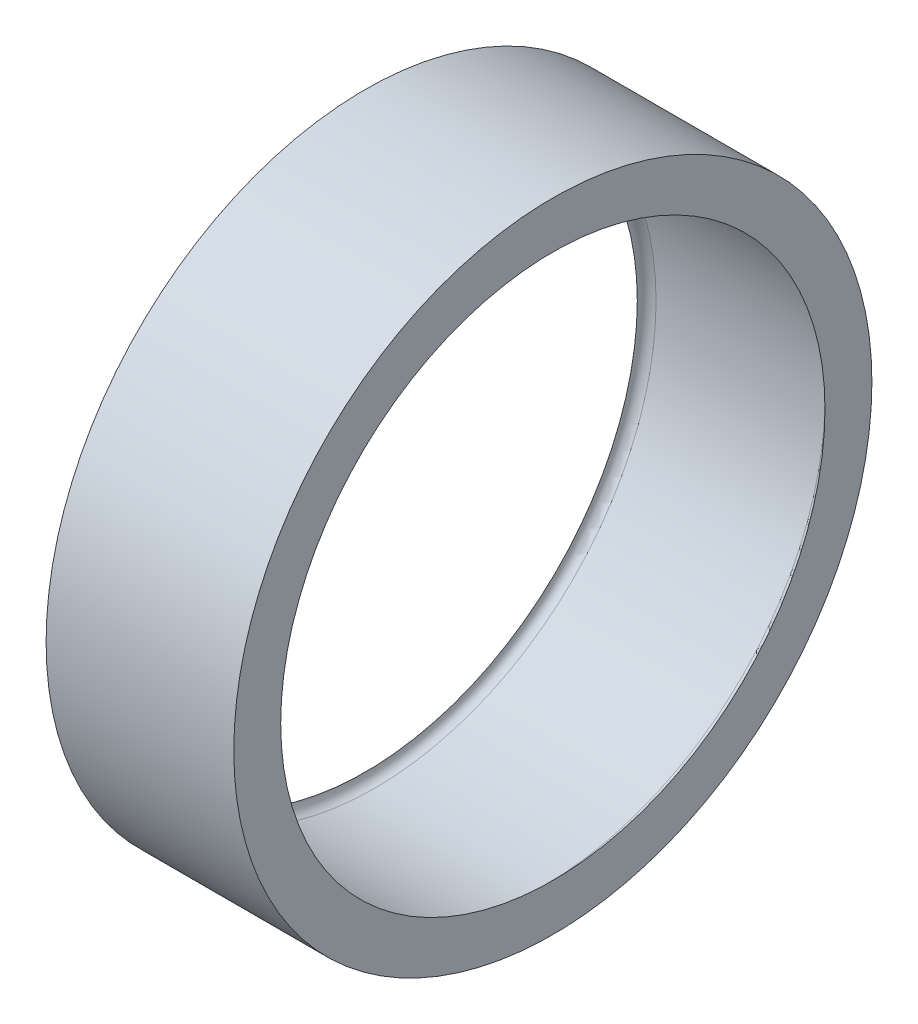
ISO-10303-21;
HEADER;
FILE_DESCRIPTION(('STEP AP214'),'2;1');
FILE_NAME('part.step','',(''),(''),'','','');
FILE_SCHEMA(('AUTOMOTIVE_DESIGN { 1 0 10303 214 1 1 1 1 }'));
ENDSEC;
DATA;
#1=APPLICATION_CONTEXT('core data for automotive mechanical design processes');
#2=APPLICATION_PROTOCOL_DEFINITION('international standard','automotive_design',2000,#1);
#3=PRODUCT_CONTEXT('',#1,'mechanical');
#4=PRODUCT('Part','Part','',(#3));
#5=PRODUCT_RELATED_PRODUCT_CATEGORY('part','',(#4));
#6=PRODUCT_DEFINITION_FORMATION('','',#4);
#7=PRODUCT_DEFINITION_CONTEXT('part definition',#1,'design');
#8=PRODUCT_DEFINITION('design','',#6,#7);
#9=PRODUCT_DEFINITION_SHAPE('','',#8);
#10=(LENGTH_UNIT() NAMED_UNIT(*) SI_UNIT(.MILLI.,.METRE.));
#11=(NAMED_UNIT(*) PLANE_ANGLE_UNIT() SI_UNIT($,.RADIAN.));
#12=(NAMED_UNIT(*) SI_UNIT($,.STERADIAN.) SOLID_ANGLE_UNIT());
#13=UNCERTAINTY_MEASURE_WITH_UNIT(LENGTH_MEASURE(1.E-05),#10,'distance_accuracy_value','');
#14=(GEOMETRIC_REPRESENTATION_CONTEXT(3) GLOBAL_UNCERTAINTY_ASSIGNED_CONTEXT((#13)) GLOBAL_UNIT_ASSIGNED_CONTEXT((#10,
#11,#12)) REPRESENTATION_CONTEXT('',''));
#15=CARTESIAN_POINT('',(0.,0.,0.));
#16=DIRECTION('',(0.,0.,1.));
#17=DIRECTION('',(1.,0.,0.));
#18=AXIS2_PLACEMENT_3D('',#15,#16,#17);
#19=CARTESIAN_POINT('',(580.832611206852,0.,0.));
#20=DIRECTION('',(-1.,0.,0.));
#21=DIRECTION('',(0.,0.,1.));
#22=AXIS2_PLACEMENT_3D('',#19,#20,#21);
#23=CYLINDRICAL_SURFACE('',#22,170.);
#24=CARTESIAN_POINT('',(0.,0.,0.));
#25=DIRECTION('',(-1.,0.,0.));
#26=DIRECTION('',(0.,0.,1.));
#27=AXIS2_PLACEMENT_3D('',#24,#25,#26);
#28=CIRCLE('',#27,170.);
#29=CARTESIAN_POINT('',(0.,0.,170.));
#30=VERTEX_POINT('',#29);
#31=EDGE_CURVE('E44',#30,#30,#28,.T.);
#32=ORIENTED_EDGE('',*,*,#31,.F.);
#33=EDGE_LOOP('',(#32));
#34=FACE_BOUND('',#33,.T.);
#35=CARTESIAN_POINT('',(100.,0.,0.));
#36=DIRECTION('',(1.,0.,0.));
#37=DIRECTION('',(0.,0.,-1.));
#38=AXIS2_PLACEMENT_3D('',#35,#36,#37);
#39=CIRCLE('',#38,170.);
#40=CARTESIAN_POINT('',(100.,0.,-170.));
#41=VERTEX_POINT('',#40);
#42=EDGE_CURVE('E10',#41,#41,#39,.F.);
#43=ORIENTED_EDGE('',*,*,#42,.T.);
#44=EDGE_LOOP('',(#43));
#45=FACE_BOUND('',#44,.T.);
#46=ADVANCED_FACE('F37',(#34,#45),#23,.T.);
#47=CARTESIAN_POINT('',(0.,0.,0.));
#48=DIRECTION('',(1.,0.,0.));
#49=DIRECTION('',(0.,0.,-1.));
#50=AXIS2_PLACEMENT_3D('',#47,#48,#49);
#51=PLANE('',#50);
#52=CARTESIAN_POINT('',(0.,0.,0.));
#53=DIRECTION('',(1.,0.,0.));
#54=DIRECTION('',(0.,0.,-1.));
#55=AXIS2_PLACEMENT_3D('',#52,#53,#54);
#56=CIRCLE('',#55,145.);
#57=CARTESIAN_POINT('',(0.,0.,-145.));
#58=VERTEX_POINT('',#57);
#59=EDGE_CURVE('E52',#58,#58,#56,.F.);
#60=ORIENTED_EDGE('',*,*,#59,.F.);
#61=EDGE_LOOP('',(#60));
#62=FACE_BOUND('',#61,.T.);
#63=ORIENTED_EDGE('',*,*,#31,.T.);
#64=EDGE_LOOP('',(#63));
#65=FACE_BOUND('',#64,.T.);
#66=ADVANCED_FACE('F39',(#62,#65),#51,.F.);
#67=CARTESIAN_POINT('',(100.,0.,0.));
#68=DIRECTION('',(1.,0.,0.));
#69=DIRECTION('',(0.,0.,-1.));
#70=AXIS2_PLACEMENT_3D('',#67,#68,#69);
#71=PLANE('',#70);
#72=CARTESIAN_POINT('',(100.,0.,0.));
#73=DIRECTION('',(1.,0.,0.));
#74=DIRECTION('',(0.,0.,-1.));
#75=AXIS2_PLACEMENT_3D('',#72,#73,#74);
#76=CIRCLE('',#75,145.);
#77=CARTESIAN_POINT('',(100.,0.,-145.));
#78=VERTEX_POINT('',#77);
#79=EDGE_CURVE('E48',#78,#78,#76,.T.);
#80=ORIENTED_EDGE('',*,*,#79,.F.);
#81=EDGE_LOOP('',(#80));
#82=FACE_BOUND('',#81,.T.);
#83=ORIENTED_EDGE('',*,*,#42,.F.);
#84=EDGE_LOOP('',(#83));
#85=FACE_BOUND('',#84,.T.);
#86=ADVANCED_FACE('F77',(#82,#85),#71,.T.);
#87=CARTESIAN_POINT('',(5.,0.,0.));
#88=DIRECTION('',(1.,0.,0.));
#89=DIRECTION('',(0.,0.,-1.));
#90=AXIS2_PLACEMENT_3D('',#87,#88,#89);
#91=TOROIDAL_SURFACE('',#90,145.,5.);
#92=ORIENTED_EDGE('',*,*,#59,.T.);
#93=EDGE_LOOP('',(#92));
#94=FACE_BOUND('',#93,.T.);
#95=CARTESIAN_POINT('',(5.,0.,0.));
#96=DIRECTION('',(1.,0.,0.));
#97=DIRECTION('',(0.,0.,-1.));
#98=AXIS2_PLACEMENT_3D('',#95,#96,#97);
#99=CIRCLE('',#98,150.);
#100=CARTESIAN_POINT('',(5.,0.,150.));
#101=VERTEX_POINT('',#100);
#102=EDGE_CURVE('E57',#101,#101,#99,.T.);
#103=ORIENTED_EDGE('',*,*,#102,.T.);
#104=EDGE_LOOP('',(#103));
#105=FACE_BOUND('',#104,.T.);
#106=ADVANCED_FACE('F69',(#94,#105),#91,.F.);
#107=CARTESIAN_POINT('',(100.,0.,0.));
#108=DIRECTION('',(-1.,0.,0.));
#109=DIRECTION('',(0.,0.,1.));
#110=AXIS2_PLACEMENT_3D('',#107,#108,#109);
#111=CYLINDRICAL_SURFACE('',#110,150.);
#112=CARTESIAN_POINT('',(95.,0.,0.));
#113=DIRECTION('',(1.,0.,0.));
#114=DIRECTION('',(0.,0.,-1.));
#115=AXIS2_PLACEMENT_3D('',#112,#113,#114);
#116=CIRCLE('',#115,150.);
#117=CARTESIAN_POINT('',(95.,0.,150.));
#118=VERTEX_POINT('',#117);
#119=EDGE_CURVE('E60',#118,#118,#116,.F.);
#120=CARTESIAN_POINT('',(5.,0.,150.));
#121=CARTESIAN_POINT('',(5.9375,0.,150.));
#122=CARTESIAN_POINT('',(6.875,0.,150.));
#123=CARTESIAN_POINT('',(8.75,0.,150.));
#124=CARTESIAN_POINT('',(9.68750000000001,0.,150.));
#125=CARTESIAN_POINT('',(11.5625,0.,150.));
#126=CARTESIAN_POINT('',(12.5,0.,150.));
#127=CARTESIAN_POINT('',(14.375,0.,150.));
#128=CARTESIAN_POINT('',(15.3125,0.,150.));
#129=CARTESIAN_POINT('',(17.1875,0.,150.));
#130=CARTESIAN_POINT('',(18.125,0.,150.));
#131=CARTESIAN_POINT('',(20.,0.,150.));
#132=CARTESIAN_POINT('',(20.9375,0.,150.));
#133=CARTESIAN_POINT('',(22.8125,0.,150.));
#134=CARTESIAN_POINT('',(23.75,0.,150.));
#135=CARTESIAN_POINT('',(25.625,0.,150.));
#136=CARTESIAN_POINT('',(26.5625,0.,150.));
#137=CARTESIAN_POINT('',(28.4375,0.,150.));
#138=CARTESIAN_POINT('',(29.375,0.,150.));
#139=CARTESIAN_POINT('',(31.25,0.,150.));
#140=CARTESIAN_POINT('',(32.1875,0.,150.));
#141=CARTESIAN_POINT('',(34.0625,0.,150.));
#142=CARTESIAN_POINT('',(35.,0.,150.));
#143=CARTESIAN_POINT('',(36.875,0.,150.));
#144=CARTESIAN_POINT('',(37.8125,0.,150.));
#145=CARTESIAN_POINT('',(39.6875,0.,150.));
#146=CARTESIAN_POINT('',(40.625,0.,150.));
#147=CARTESIAN_POINT('',(42.5,0.,150.));
#148=CARTESIAN_POINT('',(43.4375,0.,150.));
#149=CARTESIAN_POINT('',(45.3125,0.,150.));
#150=CARTESIAN_POINT('',(46.25,0.,150.));
#151=CARTESIAN_POINT('',(48.125,0.,150.));
#152=CARTESIAN_POINT('',(49.0625,0.,150.));
#153=CARTESIAN_POINT('',(50.9375,0.,150.));
#154=CARTESIAN_POINT('',(51.875,0.,150.));
#155=CARTESIAN_POINT('',(53.75,0.,150.));
#156=CARTESIAN_POINT('',(54.6875,0.,150.));
#157=CARTESIAN_POINT('',(56.5625,0.,150.));
#158=CARTESIAN_POINT('',(57.5,0.,150.));
#159=CARTESIAN_POINT('',(59.375,0.,150.));
#160=CARTESIAN_POINT('',(60.3125,0.,150.));
#161=CARTESIAN_POINT('',(62.1875,0.,150.));
#162=CARTESIAN_POINT('',(63.125,0.,150.));
#163=CARTESIAN_POINT('',(65.,0.,150.));
#164=CARTESIAN_POINT('',(65.9375,0.,150.));
#165=CARTESIAN_POINT('',(67.8125,0.,150.));
#166=CARTESIAN_POINT('',(68.75,0.,150.));
#167=CARTESIAN_POINT('',(70.625,0.,150.));
#168=CARTESIAN_POINT('',(71.5625,0.,150.));
#169=CARTESIAN_POINT('',(73.4375,0.,150.));
#170=CARTESIAN_POINT('',(74.375,0.,150.));
#171=CARTESIAN_POINT('',(76.25,0.,150.));
#172=CARTESIAN_POINT('',(77.1875,0.,150.));
#173=CARTESIAN_POINT('',(79.0625,0.,150.));
#174=CARTESIAN_POINT('',(80.,0.,150.));
#175=CARTESIAN_POINT('',(81.875,0.,150.));
#176=CARTESIAN_POINT('',(82.8125,0.,150.));
#177=CARTESIAN_POINT('',(84.6875,0.,150.));
#178=CARTESIAN_POINT('',(85.625,0.,150.));
#179=CARTESIAN_POINT('',(87.5,0.,150.));
#180=CARTESIAN_POINT('',(88.4375,0.,150.));
#181=CARTESIAN_POINT('',(90.3125,0.,150.));
#182=CARTESIAN_POINT('',(91.25,0.,150.));
#183=CARTESIAN_POINT('',(93.125,0.,150.));
#184=CARTESIAN_POINT('',(94.0625,0.,150.));
#185=CARTESIAN_POINT('',(95.,0.,150.));
#186=B_SPLINE_CURVE_WITH_KNOTS('',3,(#120,#121,#122,#123,#124,#125,#126,#127,#128,#129,#130,
#131,#132,#133,#134,#135,#136,#137,#138,#139,#140,#141,#142,#143,#144,#145,#146,#147,#148,#149,
#150,#151,#152,#153,#154,#155,#156,#157,#158,#159,#160,#161,#162,#163,#164,#165,#166,#167,#168,
#169,#170,#171,#172,#173,#174,#175,#176,#177,#178,#179,#180,#181,#182,#183,#184,#185),
.UNSPECIFIED.,.F.,.F.,(4,2,2,2,2,2,2,2,2,2,2,2,2,2,2,2,2,2,2,2,2,2,2,2,2,2,2,2,2,2,2,2,4),(0.,
2.8125,5.62500000000001,8.4375,11.25,14.0625,16.875,19.6875,22.5,25.3125,28.125,30.9375,33.75,
36.5625,39.375,42.1875,45.,47.8125,50.625,53.4375,56.25,59.0625,61.875,64.6875,67.5,70.3125,
73.125,75.9375,78.75,81.5625,84.375,87.1875,90.),.UNSPECIFIED.);
#187=EDGE_CURVE('BSEAM67',#101,#118,#186,.T.);
#188=ORIENTED_EDGE('',*,*,#102,.F.);
#189=ORIENTED_EDGE('',*,*,#119,.F.);
#190=ORIENTED_EDGE('',*,*,#187,.T.);
#191=ORIENTED_EDGE('',*,*,#187,.F.);
#192=EDGE_LOOP('',(#188,#190,#189,#191));
#193=FACE_BOUND('',#192,.T.);
#194=ADVANCED_FACE('F67',(#193),#111,.F.);
#195=CARTESIAN_POINT('',(95.,0.,0.));
#196=DIRECTION('',(1.,0.,0.));
#197=DIRECTION('',(0.,0.,-1.));
#198=AXIS2_PLACEMENT_3D('',#195,#196,#197);
#199=TOROIDAL_SURFACE('',#198,145.,5.);
#200=ORIENTED_EDGE('',*,*,#119,.T.);
#201=EDGE_LOOP('',(#200));
#202=FACE_BOUND('',#201,.T.);
#203=ORIENTED_EDGE('',*,*,#79,.T.);
#204=EDGE_LOOP('',(#203));
#205=FACE_BOUND('',#204,.T.);
#206=ADVANCED_FACE('F64',(#202,#205),#199,.F.);
#207=CLOSED_SHELL('',(#46,#66,#86,#106,#194,#206));
#208=MANIFOLD_SOLID_BREP('B2',#207);
#209=ADVANCED_BREP_SHAPE_REPRESENTATION('',(#18,#208),#14);
#210=SHAPE_DEFINITION_REPRESENTATION(#9,#209);
ENDSEC;
END-ISO-10303-21;
